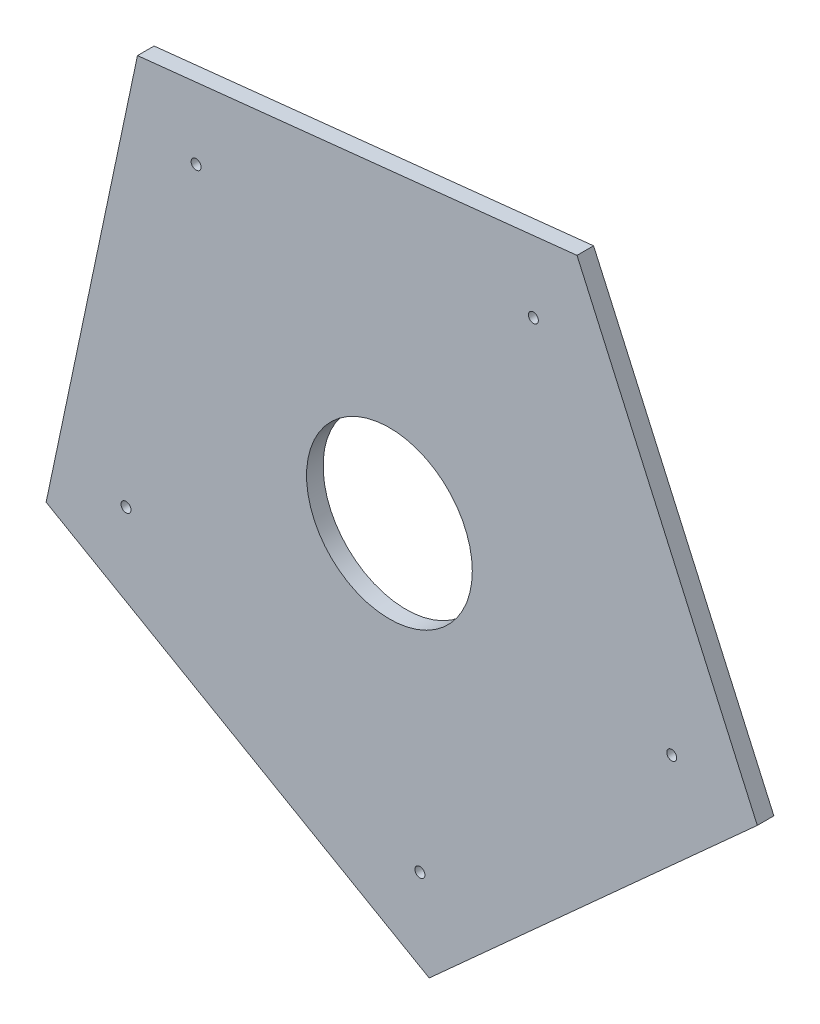
ISO-10303-21;
HEADER;
FILE_DESCRIPTION(('STEP AP214'),'2;1');
FILE_NAME('part.step','',(''),(''),'','','');
FILE_SCHEMA(('AUTOMOTIVE_DESIGN { 1 0 10303 214 1 1 1 1 }'));
ENDSEC;
DATA;
#1=APPLICATION_CONTEXT('core data for automotive mechanical design processes');
#2=APPLICATION_PROTOCOL_DEFINITION('international standard','automotive_design',2000,#1);
#3=PRODUCT_CONTEXT('',#1,'mechanical');
#4=PRODUCT('Part','Part','',(#3));
#5=PRODUCT_RELATED_PRODUCT_CATEGORY('part','',(#4));
#6=PRODUCT_DEFINITION_FORMATION('','',#4);
#7=PRODUCT_DEFINITION_CONTEXT('part definition',#1,'design');
#8=PRODUCT_DEFINITION('design','',#6,#7);
#9=PRODUCT_DEFINITION_SHAPE('','',#8);
#10=(LENGTH_UNIT() NAMED_UNIT(*) SI_UNIT(.MILLI.,.METRE.));
#11=(NAMED_UNIT(*) PLANE_ANGLE_UNIT() SI_UNIT($,.RADIAN.));
#12=(NAMED_UNIT(*) SI_UNIT($,.STERADIAN.) SOLID_ANGLE_UNIT());
#13=UNCERTAINTY_MEASURE_WITH_UNIT(LENGTH_MEASURE(1.E-05),#10,'distance_accuracy_value','');
#14=(GEOMETRIC_REPRESENTATION_CONTEXT(3) GLOBAL_UNCERTAINTY_ASSIGNED_CONTEXT((#13)) GLOBAL_UNIT_ASSIGNED_CONTEXT((#10,
#11,#12)) REPRESENTATION_CONTEXT('',''));
#15=CARTESIAN_POINT('',(0.,0.,0.));
#16=DIRECTION('',(0.,0.,1.));
#17=DIRECTION('',(1.,0.,0.));
#18=AXIS2_PLACEMENT_3D('',#15,#16,#17);
#19=CARTESIAN_POINT('',(66.5828797968972,-14.0642676151945,3.));
#20=DIRECTION('',(-0.913028145164977,-0.407896563036024,0.));
#21=DIRECTION('',(0.407896563036024,-0.913028145164977,0.));
#22=AXIS2_PLACEMENT_3D('',#19,#20,#21);
#23=PLANE('',#22);
#24=DIRECTION('',(-0.407896563036024,0.913028145164977,0.));
#25=VECTOR('',#24,1.);
#26=CARTESIAN_POINT('',(66.5828797968972,-14.0642676151945,0.));
#27=LINE('',#26,#25);
#28=CARTESIAN_POINT('',(66.5828797968972,-14.0642676151945,0.));
#29=VERTEX_POINT('',#28);
#30=CARTESIAN_POINT('',(33.9511547540153,58.9779839980037,0.));
#31=VERTEX_POINT('',#30);
#32=EDGE_CURVE('E111',#29,#31,#27,.T.);
#33=ORIENTED_EDGE('',*,*,#32,.T.);
#34=DIRECTION('',(0.,0.,-1.));
#35=VECTOR('',#34,1.);
#36=CARTESIAN_POINT('',(33.9511547540153,58.9779839980037,3.));
#37=LINE('',#36,#35);
#38=CARTESIAN_POINT('',(33.9511547540153,58.9779839980037,3.));
#39=VERTEX_POINT('',#38);
#40=EDGE_CURVE('E11',#39,#31,#37,.T.);
#41=ORIENTED_EDGE('',*,*,#40,.F.);
#42=DIRECTION('',(-0.407896563036024,0.913028145164977,0.));
#43=VECTOR('',#42,1.);
#44=CARTESIAN_POINT('',(66.5828797968972,-14.0642676151945,3.));
#45=LINE('',#44,#43);
#46=CARTESIAN_POINT('',(66.5828797968972,-14.0642676151945,3.));
#47=VERTEX_POINT('',#46);
#48=EDGE_CURVE('E120',#47,#39,#45,.T.);
#49=ORIENTED_EDGE('',*,*,#48,.F.);
#50=DIRECTION('',(0.,0.,-1.));
#51=VECTOR('',#50,1.);
#52=CARTESIAN_POINT('',(66.5828797968972,-14.0642676151945,3.));
#53=LINE('',#52,#51);
#54=EDGE_CURVE('E107',#47,#29,#53,.T.);
#55=ORIENTED_EDGE('',*,*,#54,.T.);
#56=EDGE_LOOP('',(#33,#41,#49,#55));
#57=FACE_BOUND('',#56,.T.);
#58=ADVANCED_FACE('F37',(#57),#23,.F.);
#59=CARTESIAN_POINT('',(33.9511547540153,58.9779839980037,3.));
#60=DIRECTION('',(0.105791471051193,-0.994388336945292,0.));
#61=DIRECTION('',(0.994388336945292,0.105791471051193,0.));
#62=AXIS2_PLACEMENT_3D('',#59,#60,#61);
#63=PLANE('',#62);
#64=DIRECTION('',(-0.994388336945293,-0.105791471051193,0.));
#65=VECTOR('',#64,1.);
#66=CARTESIAN_POINT('',(33.9511547540153,58.9779839980037,0.));
#67=LINE('',#66,#65);
#68=CARTESIAN_POINT('',(-45.5999122016082,50.5146663139082,0.));
#69=VERTEX_POINT('',#68);
#70=EDGE_CURVE('E114',#31,#69,#67,.T.);
#71=ORIENTED_EDGE('',*,*,#70,.T.);
#72=DIRECTION('',(0.,0.,-1.));
#73=VECTOR('',#72,1.);
#74=CARTESIAN_POINT('',(-45.5999122016082,50.5146663139082,3.));
#75=LINE('',#74,#73);
#76=CARTESIAN_POINT('',(-45.5999122016082,50.5146663139082,3.));
#77=VERTEX_POINT('',#76);
#78=EDGE_CURVE('E45',#77,#69,#75,.T.);
#79=ORIENTED_EDGE('',*,*,#78,.F.);
#80=DIRECTION('',(-0.994388336945293,-0.105791471051193,0.));
#81=VECTOR('',#80,1.);
#82=CARTESIAN_POINT('',(33.9511547540153,58.9779839980037,3.));
#83=LINE('',#82,#81);
#84=EDGE_CURVE('E87',#39,#77,#83,.T.);
#85=ORIENTED_EDGE('',*,*,#84,.F.);
#86=ORIENTED_EDGE('',*,*,#40,.T.);
#87=EDGE_LOOP('',(#71,#79,#85,#86));
#88=FACE_BOUND('',#87,.T.);
#89=ADVANCED_FACE('F141',(#88),#63,.F.);
#90=CARTESIAN_POINT('',(-45.5999122016082,50.5146663139082,3.));
#91=DIRECTION('',(0.978410869994465,-0.206669227212649,0.));
#92=DIRECTION('',(0.20666922721265,0.978410869994465,0.));
#93=AXIS2_PLACEMENT_3D('',#90,#91,#92);
#94=PLANE('',#93);
#95=DIRECTION('',(-0.20666922721265,-0.978410869994465,0.));
#96=VECTOR('',#95,1.);
#97=CARTESIAN_POINT('',(-45.5999122016082,50.5146663139082,0.));
#98=LINE('',#97,#96);
#99=CARTESIAN_POINT('',(-62.1334503786201,-27.758203285649,0.));
#100=VERTEX_POINT('',#99);
#101=EDGE_CURVE('E102',#69,#100,#98,.T.);
#102=ORIENTED_EDGE('',*,*,#101,.T.);
#103=DIRECTION('',(0.,0.,-1.));
#104=VECTOR('',#103,1.);
#105=CARTESIAN_POINT('',(-62.1334503786201,-27.758203285649,3.));
#106=LINE('',#105,#104);
#107=CARTESIAN_POINT('',(-62.1334503786201,-27.758203285649,3.));
#108=VERTEX_POINT('',#107);
#109=EDGE_CURVE('E99',#108,#100,#106,.T.);
#110=ORIENTED_EDGE('',*,*,#109,.F.);
#111=DIRECTION('',(-0.20666922721265,-0.978410869994465,0.));
#112=VECTOR('',#111,1.);
#113=CARTESIAN_POINT('',(-45.5999122016082,50.5146663139082,3.));
#114=LINE('',#113,#112);
#115=EDGE_CURVE('E91',#77,#108,#114,.T.);
#116=ORIENTED_EDGE('',*,*,#115,.F.);
#117=ORIENTED_EDGE('',*,*,#78,.T.);
#118=EDGE_LOOP('',(#102,#110,#116,#117));
#119=FACE_BOUND('',#118,.T.);
#120=ADVANCED_FACE('F100',(#119),#94,.F.);
#121=CARTESIAN_POINT('',(-62.1334503786201,-27.758203285649,3.));
#122=DIRECTION('',(0.498899701567741,0.8666597300992,0.));
#123=DIRECTION('',(-0.8666597300992,0.498899701567741,0.));
#124=AXIS2_PLACEMENT_3D('',#121,#122,#123);
#125=PLANE('',#124);
#126=DIRECTION('',(0.8666597300992,-0.498899701567741,0.));
#127=VECTOR('',#126,1.);
#128=CARTESIAN_POINT('',(-62.1334503786201,-27.758203285649,0.));
#129=LINE('',#128,#127);
#130=CARTESIAN_POINT('',(7.19932802931592,-67.6701794110683,0.));
#131=VERTEX_POINT('',#130);
#132=EDGE_CURVE('E73',#100,#131,#129,.T.);
#133=ORIENTED_EDGE('',*,*,#132,.T.);
#134=DIRECTION('',(0.,0.,-1.));
#135=VECTOR('',#134,1.);
#136=CARTESIAN_POINT('',(7.19932802931592,-67.6701794110683,3.));
#137=LINE('',#136,#135);
#138=CARTESIAN_POINT('',(7.19932802931592,-67.6701794110683,3.));
#139=VERTEX_POINT('',#138);
#140=EDGE_CURVE('E103',#139,#131,#137,.T.);
#141=ORIENTED_EDGE('',*,*,#140,.F.);
#142=DIRECTION('',(0.8666597300992,-0.498899701567741,0.));
#143=VECTOR('',#142,1.);
#144=CARTESIAN_POINT('',(-62.1334503786201,-27.758203285649,3.));
#145=LINE('',#144,#143);
#146=EDGE_CURVE('E95',#108,#139,#145,.T.);
#147=ORIENTED_EDGE('',*,*,#146,.F.);
#148=ORIENTED_EDGE('',*,*,#109,.T.);
#149=EDGE_LOOP('',(#133,#141,#147,#148));
#150=FACE_BOUND('',#149,.T.);
#151=ADVANCED_FACE('F105',(#150),#125,.F.);
#152=CARTESIAN_POINT('',(7.19932802931592,-67.6701794110683,3.));
#153=DIRECTION('',(-0.670073897448422,0.742294397094766,0.));
#154=DIRECTION('',(-0.742294397094766,-0.670073897448422,0.));
#155=AXIS2_PLACEMENT_3D('',#152,#153,#154);
#156=PLANE('',#155);
#157=DIRECTION('',(0.742294397094766,0.670073897448422,0.));
#158=VECTOR('',#157,1.);
#159=CARTESIAN_POINT('',(7.19932802931592,-67.6701794110683,0.));
#160=LINE('',#159,#158);
#161=EDGE_CURVE('E79',#131,#29,#160,.T.);
#162=ORIENTED_EDGE('',*,*,#161,.T.);
#163=ORIENTED_EDGE('',*,*,#54,.F.);
#164=DIRECTION('',(0.742294397094766,0.670073897448422,0.));
#165=VECTOR('',#164,1.);
#166=CARTESIAN_POINT('',(7.19932802931592,-67.6701794110683,3.));
#167=LINE('',#166,#165);
#168=EDGE_CURVE('E53',#139,#47,#167,.T.);
#169=ORIENTED_EDGE('',*,*,#168,.F.);
#170=ORIENTED_EDGE('',*,*,#140,.T.);
#171=EDGE_LOOP('',(#162,#163,#169,#170));
#172=FACE_BOUND('',#171,.T.);
#173=ADVANCED_FACE('F128',(#172),#156,.F.);
#174=CARTESIAN_POINT('',(0.,0.,3.));
#175=DIRECTION('',(0.,0.,1.));
#176=DIRECTION('',(1.,0.,0.));
#177=AXIS2_PLACEMENT_3D('',#174,#175,#176);
#178=PLANE('',#177);
#179=CARTESIAN_POINT('',(5.52443061829346,-51.9269589552832,3.));
#180=DIRECTION('',(0.,0.,-1.));
#181=DIRECTION('',(-0.309016994374945,-0.951056516295155,0.));
#182=AXIS2_PLACEMENT_3D('',#179,#180,#181);
#183=CIRCLE('',#182,0.899999999999996);
#184=CARTESIAN_POINT('',(5.24631532335601,-52.7829098199488,3.));
#185=VERTEX_POINT('',#184);
#186=EDGE_CURVE('E235',#185,#185,#183,.T.);
#187=ORIENTED_EDGE('',*,*,#186,.T.);
#188=EDGE_LOOP('',(#187));
#189=FACE_BOUND('',#188,.T.);
#190=CARTESIAN_POINT('',(51.092615631111,-10.7922670450443,3.));
#191=DIRECTION('',(0.,0.,-1.));
#192=DIRECTION('',(0.809016994374951,-0.587785252292469,0.));
#193=AXIS2_PLACEMENT_3D('',#190,#191,#192);
#194=CIRCLE('',#193,0.899999999999996);
#195=CARTESIAN_POINT('',(51.8207309260485,-11.3212737721075,3.));
#196=VERTEX_POINT('',#195);
#197=EDGE_CURVE('E239',#196,#196,#194,.T.);
#198=ORIENTED_EDGE('',*,*,#197,.T.);
#199=EDGE_LOOP('',(#198));
#200=FACE_BOUND('',#199,.T.);
#201=CARTESIAN_POINT('',(26.052542415867,45.2569711057805,3.));
#202=DIRECTION('',(0.,0.,-1.));
#203=DIRECTION('',(0.809016994374942,0.58778525229248,0.));
#204=AXIS2_PLACEMENT_3D('',#201,#202,#203);
#205=CIRCLE('',#204,0.899999999999996);
#206=CARTESIAN_POINT('',(26.7806577108045,45.7859778328437,3.));
#207=VERTEX_POINT('',#206);
#208=EDGE_CURVE('E249',#207,#207,#205,.T.);
#209=ORIENTED_EDGE('',*,*,#208,.T.);
#210=EDGE_LOOP('',(#209));
#211=FACE_BOUND('',#210,.T.);
#212=CARTESIAN_POINT('',(-34.991258924757,38.7626134162883,3.));
#213=DIRECTION('',(0.,0.,-1.));
#214=DIRECTION('',(-0.309016994374958,0.95105651629515,0.));
#215=AXIS2_PLACEMENT_3D('',#212,#213,#214);
#216=CIRCLE('',#215,0.899999999999996);
#217=CARTESIAN_POINT('',(-35.2693742196945,39.6185642809539,3.));
#218=VERTEX_POINT('',#217);
#219=EDGE_CURVE('E255',#218,#218,#216,.T.);
#220=ORIENTED_EDGE('',*,*,#219,.T.);
#221=EDGE_LOOP('',(#220));
#222=FACE_BOUND('',#221,.T.);
#223=CARTESIAN_POINT('',(-47.6783297405151,-21.3003585217412,3.));
#224=DIRECTION('',(0.,0.,-1.));
#225=DIRECTION('',(-1.,0.,0.));
#226=AXIS2_PLACEMENT_3D('',#223,#224,#225);
#227=CIRCLE('',#226,0.899999999999996);
#228=CARTESIAN_POINT('',(-48.5783297405151,-21.3003585217412,3.));
#229=VERTEX_POINT('',#228);
#230=EDGE_CURVE('E261',#229,#229,#227,.T.);
#231=ORIENTED_EDGE('',*,*,#230,.T.);
#232=EDGE_LOOP('',(#231));
#233=FACE_BOUND('',#232,.T.);
#234=CARTESIAN_POINT('',(0.,0.,3.));
#235=DIRECTION('',(0.,0.,1.));
#236=DIRECTION('',(1.,0.,0.));
#237=AXIS2_PLACEMENT_3D('',#234,#235,#236);
#238=CIRCLE('',#237,15.);
#239=CARTESIAN_POINT('',(15.,0.,3.));
#240=VERTEX_POINT('',#239);
#241=EDGE_CURVE('E264',#240,#240,#238,.T.);
#242=ORIENTED_EDGE('',*,*,#241,.F.);
#243=EDGE_LOOP('',(#242));
#244=FACE_BOUND('',#243,.T.);
#245=ORIENTED_EDGE('',*,*,#48,.T.);
#246=ORIENTED_EDGE('',*,*,#84,.T.);
#247=ORIENTED_EDGE('',*,*,#115,.T.);
#248=ORIENTED_EDGE('',*,*,#146,.T.);
#249=ORIENTED_EDGE('',*,*,#168,.T.);
#250=EDGE_LOOP('',(#245,#246,#247,#248,#249));
#251=FACE_BOUND('',#250,.T.);
#252=ADVANCED_FACE('F93',(#189,#200,#211,#222,#233,#244,#251),#178,.T.);
#253=CARTESIAN_POINT('',(0.,0.,0.));
#254=DIRECTION('',(0.,0.,1.));
#255=DIRECTION('',(1.,0.,0.));
#256=AXIS2_PLACEMENT_3D('',#253,#254,#255);
#257=PLANE('',#256);
#258=CARTESIAN_POINT('',(5.52443061829346,-51.9269589552832,0.));
#259=DIRECTION('',(0.,0.,-1.));
#260=DIRECTION('',(-0.309016994374945,-0.951056516295155,0.));
#261=AXIS2_PLACEMENT_3D('',#258,#259,#260);
#262=CIRCLE('',#261,0.899999999999996);
#263=CARTESIAN_POINT('',(5.24631532335601,-52.7829098199488,0.));
#264=VERTEX_POINT('',#263);
#265=EDGE_CURVE('E238',#264,#264,#262,.T.);
#266=ORIENTED_EDGE('',*,*,#265,.F.);
#267=EDGE_LOOP('',(#266));
#268=FACE_BOUND('',#267,.T.);
#269=CARTESIAN_POINT('',(51.092615631111,-10.7922670450443,0.));
#270=DIRECTION('',(0.,0.,-1.));
#271=DIRECTION('',(0.809016994374951,-0.587785252292469,0.));
#272=AXIS2_PLACEMENT_3D('',#269,#270,#271);
#273=CIRCLE('',#272,0.899999999999996);
#274=CARTESIAN_POINT('',(51.8207309260485,-11.3212737721075,0.));
#275=VERTEX_POINT('',#274);
#276=EDGE_CURVE('E244',#275,#275,#273,.T.);
#277=ORIENTED_EDGE('',*,*,#276,.F.);
#278=EDGE_LOOP('',(#277));
#279=FACE_BOUND('',#278,.T.);
#280=CARTESIAN_POINT('',(26.052542415867,45.2569711057805,0.));
#281=DIRECTION('',(0.,0.,-1.));
#282=DIRECTION('',(0.809016994374942,0.58778525229248,0.));
#283=AXIS2_PLACEMENT_3D('',#280,#281,#282);
#284=CIRCLE('',#283,0.899999999999996);
#285=CARTESIAN_POINT('',(26.7806577108045,45.7859778328437,0.));
#286=VERTEX_POINT('',#285);
#287=EDGE_CURVE('E252',#286,#286,#284,.T.);
#288=ORIENTED_EDGE('',*,*,#287,.F.);
#289=EDGE_LOOP('',(#288));
#290=FACE_BOUND('',#289,.T.);
#291=CARTESIAN_POINT('',(-34.991258924757,38.7626134162883,0.));
#292=DIRECTION('',(0.,0.,-1.));
#293=DIRECTION('',(-0.309016994374958,0.95105651629515,0.));
#294=AXIS2_PLACEMENT_3D('',#291,#292,#293);
#295=CIRCLE('',#294,0.899999999999996);
#296=CARTESIAN_POINT('',(-35.2693742196945,39.6185642809539,0.));
#297=VERTEX_POINT('',#296);
#298=EDGE_CURVE('E258',#297,#297,#295,.T.);
#299=ORIENTED_EDGE('',*,*,#298,.F.);
#300=EDGE_LOOP('',(#299));
#301=FACE_BOUND('',#300,.T.);
#302=CARTESIAN_POINT('',(-47.6783297405151,-21.3003585217412,0.));
#303=DIRECTION('',(0.,0.,-1.));
#304=DIRECTION('',(-1.,0.,0.));
#305=AXIS2_PLACEMENT_3D('',#302,#303,#304);
#306=CIRCLE('',#305,0.899999999999996);
#307=CARTESIAN_POINT('',(-48.5783297405151,-21.3003585217412,0.));
#308=VERTEX_POINT('',#307);
#309=EDGE_CURVE('E241',#308,#308,#306,.T.);
#310=ORIENTED_EDGE('',*,*,#309,.F.);
#311=EDGE_LOOP('',(#310));
#312=FACE_BOUND('',#311,.T.);
#313=CARTESIAN_POINT('',(0.,0.,0.));
#314=DIRECTION('',(0.,0.,1.));
#315=DIRECTION('',(1.,0.,0.));
#316=AXIS2_PLACEMENT_3D('',#313,#314,#315);
#317=CIRCLE('',#316,15.);
#318=CARTESIAN_POINT('',(15.,0.,0.));
#319=VERTEX_POINT('',#318);
#320=EDGE_CURVE('E115',#319,#319,#317,.T.);
#321=ORIENTED_EDGE('',*,*,#320,.T.);
#322=EDGE_LOOP('',(#321));
#323=FACE_BOUND('',#322,.T.);
#324=ORIENTED_EDGE('',*,*,#32,.F.);
#325=ORIENTED_EDGE('',*,*,#161,.F.);
#326=ORIENTED_EDGE('',*,*,#132,.F.);
#327=ORIENTED_EDGE('',*,*,#101,.F.);
#328=ORIENTED_EDGE('',*,*,#70,.F.);
#329=EDGE_LOOP('',(#324,#325,#326,#327,#328));
#330=FACE_BOUND('',#329,.T.);
#331=ADVANCED_FACE('F124',(#268,#279,#290,#301,#312,#323,#330),#257,.F.);
#332=CARTESIAN_POINT('',(0.,0.,0.));
#333=DIRECTION('',(0.,0.,1.));
#334=DIRECTION('',(1.,0.,0.));
#335=AXIS2_PLACEMENT_3D('',#332,#333,#334);
#336=CYLINDRICAL_SURFACE('',#335,15.);
#337=ORIENTED_EDGE('',*,*,#320,.F.);
#338=EDGE_LOOP('',(#337));
#339=FACE_BOUND('',#338,.T.);
#340=ORIENTED_EDGE('',*,*,#241,.T.);
#341=EDGE_LOOP('',(#340));
#342=FACE_BOUND('',#341,.T.);
#343=ADVANCED_FACE('F165',(#339,#342),#336,.F.);
#344=CARTESIAN_POINT('',(-47.6783297405151,-21.3003585217412,3.));
#345=DIRECTION('',(0.,0.,-1.));
#346=DIRECTION('',(-1.,0.,0.));
#347=AXIS2_PLACEMENT_3D('',#344,#345,#346);
#348=CYLINDRICAL_SURFACE('',#347,0.899999999999996);
#349=ORIENTED_EDGE('',*,*,#230,.F.);
#350=EDGE_LOOP('',(#349));
#351=FACE_BOUND('',#350,.T.);
#352=ORIENTED_EDGE('',*,*,#309,.T.);
#353=EDGE_LOOP('',(#352));
#354=FACE_BOUND('',#353,.T.);
#355=ADVANCED_FACE('F170',(#351,#354),#348,.F.);
#356=CARTESIAN_POINT('',(-34.991258924757,38.7626134162883,3.));
#357=DIRECTION('',(0.,0.,-1.));
#358=DIRECTION('',(-1.,0.,0.));
#359=AXIS2_PLACEMENT_3D('',#356,#357,#358);
#360=CYLINDRICAL_SURFACE('',#359,0.899999999999996);
#361=ORIENTED_EDGE('',*,*,#219,.F.);
#362=EDGE_LOOP('',(#361));
#363=FACE_BOUND('',#362,.T.);
#364=ORIENTED_EDGE('',*,*,#298,.T.);
#365=EDGE_LOOP('',(#364));
#366=FACE_BOUND('',#365,.T.);
#367=ADVANCED_FACE('F181',(#363,#366),#360,.F.);
#368=CARTESIAN_POINT('',(26.052542415867,45.2569711057805,3.));
#369=DIRECTION('',(0.,0.,-1.));
#370=DIRECTION('',(-1.,0.,0.));
#371=AXIS2_PLACEMENT_3D('',#368,#369,#370);
#372=CYLINDRICAL_SURFACE('',#371,0.899999999999996);
#373=ORIENTED_EDGE('',*,*,#208,.F.);
#374=EDGE_LOOP('',(#373));
#375=FACE_BOUND('',#374,.T.);
#376=ORIENTED_EDGE('',*,*,#287,.T.);
#377=EDGE_LOOP('',(#376));
#378=FACE_BOUND('',#377,.T.);
#379=ADVANCED_FACE('F198',(#375,#378),#372,.F.);
#380=CARTESIAN_POINT('',(51.092615631111,-10.7922670450443,3.));
#381=DIRECTION('',(0.,0.,-1.));
#382=DIRECTION('',(-1.,0.,0.));
#383=AXIS2_PLACEMENT_3D('',#380,#381,#382);
#384=CYLINDRICAL_SURFACE('',#383,0.899999999999996);
#385=ORIENTED_EDGE('',*,*,#197,.F.);
#386=EDGE_LOOP('',(#385));
#387=FACE_BOUND('',#386,.T.);
#388=ORIENTED_EDGE('',*,*,#276,.T.);
#389=EDGE_LOOP('',(#388));
#390=FACE_BOUND('',#389,.T.);
#391=ADVANCED_FACE('F208',(#387,#390),#384,.F.);
#392=CARTESIAN_POINT('',(5.52443061829346,-51.9269589552832,3.));
#393=DIRECTION('',(0.,0.,-1.));
#394=DIRECTION('',(-1.,0.,0.));
#395=AXIS2_PLACEMENT_3D('',#392,#393,#394);
#396=CYLINDRICAL_SURFACE('',#395,0.899999999999996);
#397=ORIENTED_EDGE('',*,*,#186,.F.);
#398=EDGE_LOOP('',(#397));
#399=FACE_BOUND('',#398,.T.);
#400=ORIENTED_EDGE('',*,*,#265,.T.);
#401=EDGE_LOOP('',(#400));
#402=FACE_BOUND('',#401,.T.);
#403=ADVANCED_FACE('F218',(#399,#402),#396,.F.);
#404=CLOSED_SHELL('',(#58,#89,#120,#151,#173,#252,#331,#343,#355,#367,#379,#391,#403));
#405=MANIFOLD_SOLID_BREP('B2',#404);
#406=ADVANCED_BREP_SHAPE_REPRESENTATION('',(#18,#405),#14);
#407=SHAPE_DEFINITION_REPRESENTATION(#9,#406);
ENDSEC;
END-ISO-10303-21;
